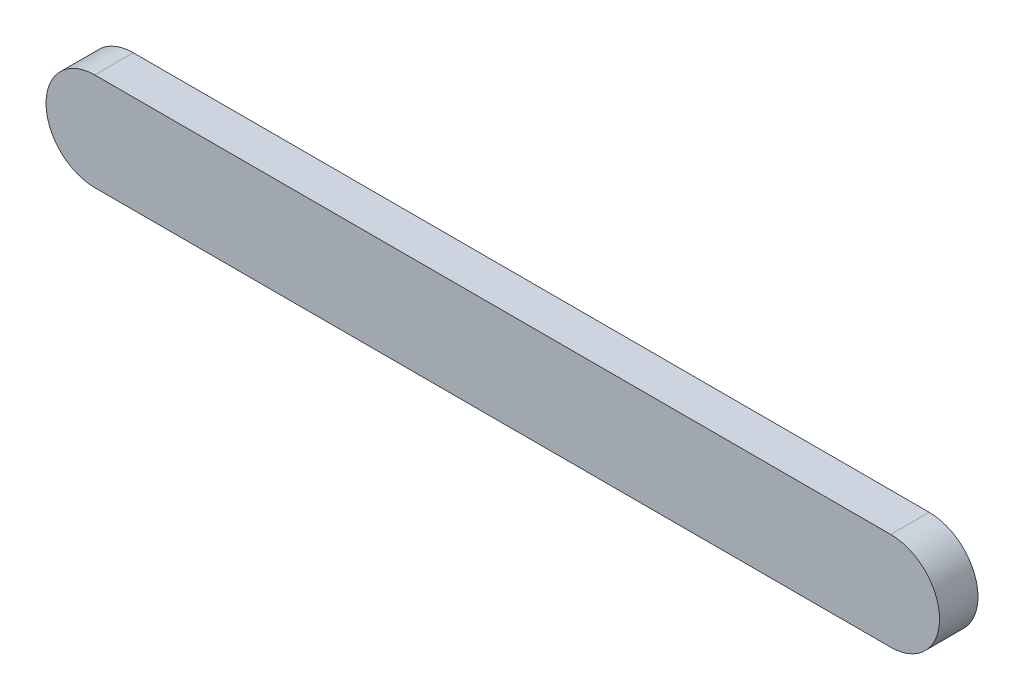
ISO-10303-21;
HEADER;
FILE_DESCRIPTION(('STEP AP214'),'2;1');
FILE_NAME('part.step','',(''),(''),'','','');
FILE_SCHEMA(('AUTOMOTIVE_DESIGN { 1 0 10303 214 1 1 1 1 }'));
ENDSEC;
DATA;
#1=APPLICATION_CONTEXT('core data for automotive mechanical design processes');
#2=APPLICATION_PROTOCOL_DEFINITION('international standard','automotive_design',2000,#1);
#3=PRODUCT_CONTEXT('',#1,'mechanical');
#4=PRODUCT('Part','Part','',(#3));
#5=PRODUCT_RELATED_PRODUCT_CATEGORY('part','',(#4));
#6=PRODUCT_DEFINITION_FORMATION('','',#4);
#7=PRODUCT_DEFINITION_CONTEXT('part definition',#1,'design');
#8=PRODUCT_DEFINITION('design','',#6,#7);
#9=PRODUCT_DEFINITION_SHAPE('','',#8);
#10=(LENGTH_UNIT() NAMED_UNIT(*) SI_UNIT(.MILLI.,.METRE.));
#11=(NAMED_UNIT(*) PLANE_ANGLE_UNIT() SI_UNIT($,.RADIAN.));
#12=(NAMED_UNIT(*) SI_UNIT($,.STERADIAN.) SOLID_ANGLE_UNIT());
#13=UNCERTAINTY_MEASURE_WITH_UNIT(LENGTH_MEASURE(1.E-05),#10,'distance_accuracy_value','');
#14=(GEOMETRIC_REPRESENTATION_CONTEXT(3) GLOBAL_UNCERTAINTY_ASSIGNED_CONTEXT((#13)) GLOBAL_UNIT_ASSIGNED_CONTEXT((#10,
#11,#12)) REPRESENTATION_CONTEXT('',''));
#15=CARTESIAN_POINT('',(0.,0.,0.));
#16=DIRECTION('',(0.,0.,1.));
#17=DIRECTION('',(1.,0.,0.));
#18=AXIS2_PLACEMENT_3D('',#15,#16,#17);
#19=CARTESIAN_POINT('',(133.0887356,112.649,0.));
#20=DIRECTION('',(0.,1.,0.));
#21=DIRECTION('',(1.,0.,0.));
#22=AXIS2_PLACEMENT_3D('',#19,#20,#21);
#23=PLANE('',#22);
#24=DIRECTION('',(1.,0.,0.));
#25=VECTOR('',#24,1.);
#26=CARTESIAN_POINT('',(133.0887356,112.649,0.1999996));
#27=LINE('',#26,#25);
#28=CARTESIAN_POINT('',(133.0887356,112.649,0.1999996));
#29=VERTEX_POINT('',#28);
#30=CARTESIAN_POINT('',(137.228072,112.649,0.1999996));
#31=VERTEX_POINT('',#30);
#32=EDGE_CURVE('E11',#29,#31,#27,.T.);
#33=ORIENTED_EDGE('',*,*,#32,.F.);
#34=DIRECTION('',(0.,0.,1.));
#35=VECTOR('',#34,1.);
#36=CARTESIAN_POINT('',(133.0887356,112.649,0.));
#37=LINE('',#36,#35);
#38=CARTESIAN_POINT('',(133.0887356,112.649,0.));
#39=VERTEX_POINT('',#38);
#40=EDGE_CURVE('E24',#39,#29,#37,.T.);
#41=ORIENTED_EDGE('',*,*,#40,.F.);
#42=DIRECTION('',(1.,0.,0.));
#43=VECTOR('',#42,1.);
#44=CARTESIAN_POINT('',(133.0887356,112.649,0.));
#45=LINE('',#44,#43);
#46=CARTESIAN_POINT('',(137.228072,112.649,0.));
#47=VERTEX_POINT('',#46);
#48=EDGE_CURVE('E75',#39,#47,#45,.T.);
#49=ORIENTED_EDGE('',*,*,#48,.T.);
#50=DIRECTION('',(0.,0.,1.));
#51=VECTOR('',#50,1.);
#52=CARTESIAN_POINT('',(137.228072,112.649,0.));
#53=LINE('',#52,#51);
#54=EDGE_CURVE('E37',#47,#31,#53,.T.);
#55=ORIENTED_EDGE('',*,*,#54,.T.);
#56=EDGE_LOOP('',(#33,#41,#49,#55));
#57=FACE_BOUND('',#56,.T.);
#58=ADVANCED_FACE('F17',(#57),#23,.F.);
#59=CARTESIAN_POINT('',(137.228072,112.903,0.));
#60=DIRECTION('',(0.,0.,-1.));
#61=DIRECTION('',(0.,-1.,0.));
#62=AXIS2_PLACEMENT_3D('',#59,#60,#61);
#63=CYLINDRICAL_SURFACE('',#62,0.253999999999995);
#64=CARTESIAN_POINT('',(137.228072,112.903,0.1999996));
#65=DIRECTION('',(0.,0.,1.));
#66=DIRECTION('',(0.,-1.,0.));
#67=AXIS2_PLACEMENT_3D('',#64,#65,#66);
#68=CIRCLE('',#67,0.253999999999995);
#69=CARTESIAN_POINT('',(137.228072,113.157,0.1999996));
#70=VERTEX_POINT('',#69);
#71=EDGE_CURVE('E83',#31,#70,#68,.T.);
#72=ORIENTED_EDGE('',*,*,#71,.F.);
#73=ORIENTED_EDGE('',*,*,#54,.F.);
#74=CARTESIAN_POINT('',(137.228072,112.903,0.));
#75=DIRECTION('',(0.,0.,1.));
#76=DIRECTION('',(0.,-1.,0.));
#77=AXIS2_PLACEMENT_3D('',#74,#75,#76);
#78=CIRCLE('',#77,0.253999999999995);
#79=CARTESIAN_POINT('',(137.228072,113.157,0.));
#80=VERTEX_POINT('',#79);
#81=EDGE_CURVE('E81',#47,#80,#78,.T.);
#82=ORIENTED_EDGE('',*,*,#81,.T.);
#83=DIRECTION('',(0.,0.,1.));
#84=VECTOR('',#83,1.);
#85=CARTESIAN_POINT('',(137.228072,113.157,0.));
#86=LINE('',#85,#84);
#87=EDGE_CURVE('E67',#80,#70,#86,.T.);
#88=ORIENTED_EDGE('',*,*,#87,.T.);
#89=EDGE_LOOP('',(#72,#73,#82,#88));
#90=FACE_BOUND('',#89,.T.);
#91=ADVANCED_FACE('F89',(#90),#63,.T.);
#92=CARTESIAN_POINT('',(137.228072,113.157,0.));
#93=DIRECTION('',(0.,-1.,0.));
#94=DIRECTION('',(-1.,0.,0.));
#95=AXIS2_PLACEMENT_3D('',#92,#93,#94);
#96=PLANE('',#95);
#97=DIRECTION('',(-1.,0.,0.));
#98=VECTOR('',#97,1.);
#99=CARTESIAN_POINT('',(137.228072,113.157,0.1999996));
#100=LINE('',#99,#98);
#101=CARTESIAN_POINT('',(133.0887356,113.157,0.1999996));
#102=VERTEX_POINT('',#101);
#103=EDGE_CURVE('E71',#70,#102,#100,.T.);
#104=ORIENTED_EDGE('',*,*,#103,.F.);
#105=ORIENTED_EDGE('',*,*,#87,.F.);
#106=DIRECTION('',(-1.,0.,0.));
#107=VECTOR('',#106,1.);
#108=CARTESIAN_POINT('',(137.228072,113.157,0.));
#109=LINE('',#108,#107);
#110=CARTESIAN_POINT('',(133.0887356,113.157,0.));
#111=VERTEX_POINT('',#110);
#112=EDGE_CURVE('E63',#80,#111,#109,.T.);
#113=ORIENTED_EDGE('',*,*,#112,.T.);
#114=DIRECTION('',(0.,0.,1.));
#115=VECTOR('',#114,1.);
#116=CARTESIAN_POINT('',(133.0887356,113.157,0.));
#117=LINE('',#116,#115);
#118=EDGE_CURVE('E53',#111,#102,#117,.T.);
#119=ORIENTED_EDGE('',*,*,#118,.T.);
#120=EDGE_LOOP('',(#104,#105,#113,#119));
#121=FACE_BOUND('',#120,.T.);
#122=ADVANCED_FACE('F66',(#121),#96,.F.);
#123=CARTESIAN_POINT('',(133.0887356,112.903,0.));
#124=DIRECTION('',(0.,0.,-1.));
#125=DIRECTION('',(-1.11896493820486E-13,1.,0.));
#126=AXIS2_PLACEMENT_3D('',#123,#124,#125);
#127=CYLINDRICAL_SURFACE('',#126,0.254000000000005);
#128=CARTESIAN_POINT('',(133.0887356,112.903,0.1999996));
#129=DIRECTION('',(0.,0.,1.));
#130=DIRECTION('',(-1.11896493820486E-13,1.,0.));
#131=AXIS2_PLACEMENT_3D('',#128,#129,#130);
#132=CIRCLE('',#131,0.254000000000005);
#133=EDGE_CURVE('E59',#102,#29,#132,.T.);
#134=ORIENTED_EDGE('',*,*,#133,.F.);
#135=ORIENTED_EDGE('',*,*,#118,.F.);
#136=CARTESIAN_POINT('',(133.0887356,112.903,0.));
#137=DIRECTION('',(0.,0.,1.));
#138=DIRECTION('',(-1.11896493820486E-13,1.,0.));
#139=AXIS2_PLACEMENT_3D('',#136,#137,#138);
#140=CIRCLE('',#139,0.254000000000005);
#141=EDGE_CURVE('E57',#111,#39,#140,.T.);
#142=ORIENTED_EDGE('',*,*,#141,.T.);
#143=ORIENTED_EDGE('',*,*,#40,.T.);
#144=EDGE_LOOP('',(#134,#135,#142,#143));
#145=FACE_BOUND('',#144,.T.);
#146=ADVANCED_FACE('F55',(#145),#127,.T.);
#147=CARTESIAN_POINT('',(133.0887356,112.649,0.));
#148=DIRECTION('',(0.,0.,-1.));
#149=DIRECTION('',(-1.,0.,0.));
#150=AXIS2_PLACEMENT_3D('',#147,#148,#149);
#151=PLANE('',#150);
#152=ORIENTED_EDGE('',*,*,#141,.F.);
#153=ORIENTED_EDGE('',*,*,#112,.F.);
#154=ORIENTED_EDGE('',*,*,#81,.F.);
#155=ORIENTED_EDGE('',*,*,#48,.F.);
#156=EDGE_LOOP('',(#152,#153,#154,#155));
#157=FACE_BOUND('',#156,.T.);
#158=ADVANCED_FACE('F74',(#157),#151,.T.);
#159=CARTESIAN_POINT('',(133.0887356,112.649,0.1999996));
#160=DIRECTION('',(0.,0.,-1.));
#161=DIRECTION('',(-1.,0.,0.));
#162=AXIS2_PLACEMENT_3D('',#159,#160,#161);
#163=PLANE('',#162);
#164=ORIENTED_EDGE('',*,*,#32,.T.);
#165=ORIENTED_EDGE('',*,*,#71,.T.);
#166=ORIENTED_EDGE('',*,*,#103,.T.);
#167=ORIENTED_EDGE('',*,*,#133,.T.);
#168=EDGE_LOOP('',(#164,#165,#166,#167));
#169=FACE_BOUND('',#168,.T.);
#170=ADVANCED_FACE('F91',(#169),#163,.F.);
#171=CLOSED_SHELL('',(#58,#91,#122,#146,#158,#170));
#172=MANIFOLD_SOLID_BREP('B1',#171);
#173=ADVANCED_BREP_SHAPE_REPRESENTATION('',(#18,#172),#14);
#174=SHAPE_DEFINITION_REPRESENTATION(#9,#173);
ENDSEC;
END-ISO-10303-21;
